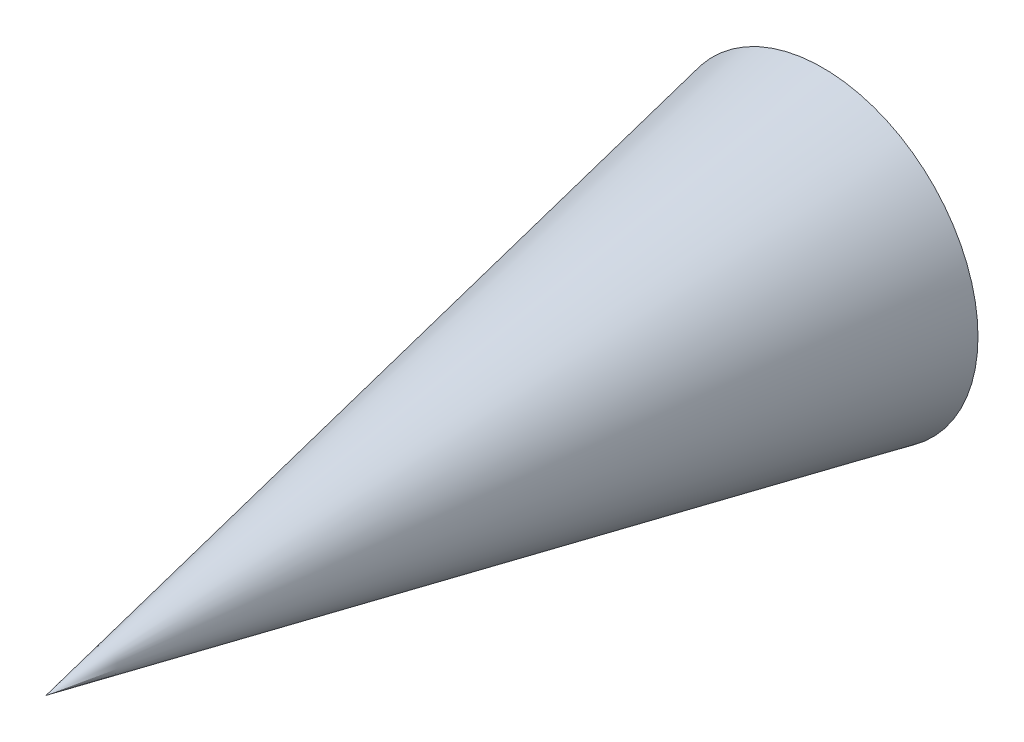
ISO-10303-21;
HEADER;
FILE_DESCRIPTION(('STEP AP214'),'2;1');
FILE_NAME('part.step','',(''),(''),'','','');
FILE_SCHEMA(('AUTOMOTIVE_DESIGN { 1 0 10303 214 1 1 1 1 }'));
ENDSEC;
DATA;
#1=APPLICATION_CONTEXT('core data for automotive mechanical design processes');
#2=APPLICATION_PROTOCOL_DEFINITION('international standard','automotive_design',2000,#1);
#3=PRODUCT_CONTEXT('',#1,'mechanical');
#4=PRODUCT('Part','Part','',(#3));
#5=PRODUCT_RELATED_PRODUCT_CATEGORY('part','',(#4));
#6=PRODUCT_DEFINITION_FORMATION('','',#4);
#7=PRODUCT_DEFINITION_CONTEXT('part definition',#1,'design');
#8=PRODUCT_DEFINITION('design','',#6,#7);
#9=PRODUCT_DEFINITION_SHAPE('','',#8);
#10=(LENGTH_UNIT() NAMED_UNIT(*) SI_UNIT(.MILLI.,.METRE.));
#11=(NAMED_UNIT(*) PLANE_ANGLE_UNIT() SI_UNIT($,.RADIAN.));
#12=(NAMED_UNIT(*) SI_UNIT($,.STERADIAN.) SOLID_ANGLE_UNIT());
#13=UNCERTAINTY_MEASURE_WITH_UNIT(LENGTH_MEASURE(1.E-05),#10,'distance_accuracy_value','');
#14=(GEOMETRIC_REPRESENTATION_CONTEXT(3) GLOBAL_UNCERTAINTY_ASSIGNED_CONTEXT((#13)) GLOBAL_UNIT_ASSIGNED_CONTEXT((#10,
#11,#12)) REPRESENTATION_CONTEXT('',''));
#15=CARTESIAN_POINT('',(0.,0.,0.));
#16=DIRECTION('',(0.,0.,1.));
#17=DIRECTION('',(1.,0.,0.));
#18=AXIS2_PLACEMENT_3D('',#15,#16,#17);
#19=CARTESIAN_POINT('',(60.,0.,0.));
#20=DIRECTION('',(0.,0.,-1.));
#21=DIRECTION('',(0.,-1.,0.));
#22=AXIS2_PLACEMENT_3D('',#19,#20,#21);
#23=PLANE('',#22);
#24=CARTESIAN_POINT('',(0.,0.,0.));
#25=DIRECTION('',(0.,0.,1.));
#26=DIRECTION('',(1.,0.,0.));
#27=AXIS2_PLACEMENT_3D('',#24,#25,#26);
#28=CIRCLE('',#27,60.);
#29=CARTESIAN_POINT('',(-60.,0.,0.));
#30=VERTEX_POINT('',#29);
#31=EDGE_CURVE('E25',#30,#30,#28,.T.);
#32=ORIENTED_EDGE('',*,*,#31,.F.);
#33=EDGE_LOOP('',(#32));
#34=FACE_BOUND('',#33,.T.);
#35=ADVANCED_FACE('F16',(#34),#23,.T.);
#36=CARTESIAN_POINT('',(0.,0.,0.));
#37=DIRECTION('',(0.,0.,-1.));
#38=DIRECTION('',(1.,0.,0.));
#39=AXIS2_PLACEMENT_3D('',#36,#37,#38);
#40=CONICAL_SURFACE('',#39,60.,0.197395559849881);
#41=DIRECTION('',(-0.196116135138184,0.,-0.98058067569092));
#42=VECTOR('',#41,1.);
#43=CARTESIAN_POINT('',(-60.,0.,0.));
#44=LINE('',#43,#42);
#45=CARTESIAN_POINT('',(0.,0.,300.));
#46=VERTEX_POINT('',#45);
#47=EDGE_CURVE('E10',#46,#30,#44,.T.);
#48=ORIENTED_EDGE('',*,*,#47,.T.);
#49=ORIENTED_EDGE('',*,*,#31,.T.);
#50=ORIENTED_EDGE('',*,*,#47,.F.);
#51=EDGE_LOOP('',(#48,#49,#50));
#52=FACE_BOUND('',#51,.T.);
#53=ADVANCED_FACE('F18',(#52),#40,.T.);
#54=CLOSED_SHELL('',(#35,#53));
#55=MANIFOLD_SOLID_BREP('B1',#54);
#56=ADVANCED_BREP_SHAPE_REPRESENTATION('',(#18,#55),#14);
#57=SHAPE_DEFINITION_REPRESENTATION(#9,#56);
ENDSEC;
END-ISO-10303-21;
